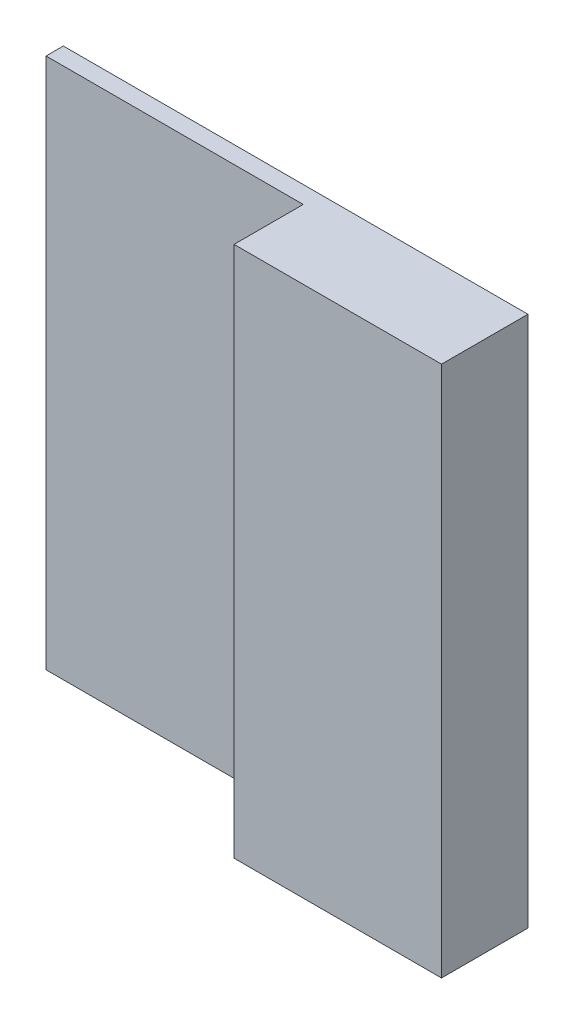
ISO-10303-21;
HEADER;
FILE_DESCRIPTION(('STEP AP214'),'2;1');
FILE_NAME('part.step','',(''),(''),'','','');
FILE_SCHEMA(('AUTOMOTIVE_DESIGN { 1 0 10303 214 1 1 1 1 }'));
ENDSEC;
DATA;
#1=APPLICATION_CONTEXT('core data for automotive mechanical design processes');
#2=APPLICATION_PROTOCOL_DEFINITION('international standard','automotive_design',2000,#1);
#3=PRODUCT_CONTEXT('',#1,'mechanical');
#4=PRODUCT('Part','Part','',(#3));
#5=PRODUCT_RELATED_PRODUCT_CATEGORY('part','',(#4));
#6=PRODUCT_DEFINITION_FORMATION('','',#4);
#7=PRODUCT_DEFINITION_CONTEXT('part definition',#1,'design');
#8=PRODUCT_DEFINITION('design','',#6,#7);
#9=PRODUCT_DEFINITION_SHAPE('','',#8);
#10=(LENGTH_UNIT() NAMED_UNIT(*) SI_UNIT(.MILLI.,.METRE.));
#11=(NAMED_UNIT(*) PLANE_ANGLE_UNIT() SI_UNIT($,.RADIAN.));
#12=(NAMED_UNIT(*) SI_UNIT($,.STERADIAN.) SOLID_ANGLE_UNIT());
#13=UNCERTAINTY_MEASURE_WITH_UNIT(LENGTH_MEASURE(1.E-05),#10,'distance_accuracy_value','');
#14=(GEOMETRIC_REPRESENTATION_CONTEXT(3) GLOBAL_UNCERTAINTY_ASSIGNED_CONTEXT((#13)) GLOBAL_UNIT_ASSIGNED_CONTEXT((#10,
#11,#12)) REPRESENTATION_CONTEXT('',''));
#15=CARTESIAN_POINT('',(0.,0.,0.));
#16=DIRECTION('',(0.,0.,1.));
#17=DIRECTION('',(1.,0.,0.));
#18=AXIS2_PLACEMENT_3D('',#15,#16,#17);
#19=CARTESIAN_POINT('',(0.,123.,-20.));
#20=DIRECTION('',(0.,0.,1.));
#21=DIRECTION('',(1.,0.,0.));
#22=AXIS2_PLACEMENT_3D('',#19,#20,#21);
#23=PLANE('',#22);
#24=DIRECTION('',(-1.,0.,0.));
#25=VECTOR('',#24,1.);
#26=CARTESIAN_POINT('',(0.,0.,-20.));
#27=LINE('',#26,#25);
#28=CARTESIAN_POINT('',(0.,0.,-20.));
#29=VERTEX_POINT('',#28);
#30=CARTESIAN_POINT('',(-107.5,0.,-20.));
#31=VERTEX_POINT('',#30);
#32=EDGE_CURVE('E119',#29,#31,#27,.T.);
#33=ORIENTED_EDGE('',*,*,#32,.T.);
#34=DIRECTION('',(0.,-1.,0.));
#35=VECTOR('',#34,1.);
#36=CARTESIAN_POINT('',(-107.5,123.,-20.));
#37=LINE('',#36,#35);
#38=CARTESIAN_POINT('',(-107.5,123.,-20.));
#39=VERTEX_POINT('',#38);
#40=EDGE_CURVE('E11',#39,#31,#37,.T.);
#41=ORIENTED_EDGE('',*,*,#40,.F.);
#42=DIRECTION('',(-1.,0.,0.));
#43=VECTOR('',#42,1.);
#44=CARTESIAN_POINT('',(0.,123.,-20.));
#45=LINE('',#44,#43);
#46=CARTESIAN_POINT('',(0.,123.,-20.));
#47=VERTEX_POINT('',#46);
#48=EDGE_CURVE('E133',#47,#39,#45,.T.);
#49=ORIENTED_EDGE('',*,*,#48,.F.);
#50=DIRECTION('',(0.,-1.,0.));
#51=VECTOR('',#50,1.);
#52=CARTESIAN_POINT('',(0.,123.,-20.));
#53=LINE('',#52,#51);
#54=EDGE_CURVE('E51',#47,#29,#53,.T.);
#55=ORIENTED_EDGE('',*,*,#54,.T.);
#56=EDGE_LOOP('',(#33,#41,#49,#55));
#57=FACE_BOUND('',#56,.T.);
#58=ADVANCED_FACE('F35',(#57),#23,.F.);
#59=CARTESIAN_POINT('',(-107.5,123.,0.));
#60=DIRECTION('',(1.,0.,0.));
#61=DIRECTION('',(0.,0.,-1.));
#62=AXIS2_PLACEMENT_3D('',#59,#60,#61);
#63=PLANE('',#62);
#64=DIRECTION('',(0.,0.,1.));
#65=VECTOR('',#64,1.);
#66=CARTESIAN_POINT('',(-107.5,0.,0.));
#67=LINE('',#66,#65);
#68=CARTESIAN_POINT('',(-107.5,0.,-16.));
#69=VERTEX_POINT('',#68);
#70=EDGE_CURVE('E121',#31,#69,#67,.T.);
#71=ORIENTED_EDGE('',*,*,#70,.T.);
#72=DIRECTION('',(0.,-1.,0.));
#73=VECTOR('',#72,1.);
#74=CARTESIAN_POINT('',(-107.5,123.,-16.));
#75=LINE('',#74,#73);
#76=CARTESIAN_POINT('',(-107.5,123.,-16.));
#77=VERTEX_POINT('',#76);
#78=EDGE_CURVE('E43',#77,#69,#75,.T.);
#79=ORIENTED_EDGE('',*,*,#78,.F.);
#80=DIRECTION('',(0.,0.,1.));
#81=VECTOR('',#80,1.);
#82=CARTESIAN_POINT('',(-107.5,123.,0.));
#83=LINE('',#82,#81);
#84=EDGE_CURVE('E83',#39,#77,#83,.T.);
#85=ORIENTED_EDGE('',*,*,#84,.F.);
#86=ORIENTED_EDGE('',*,*,#40,.T.);
#87=EDGE_LOOP('',(#71,#79,#85,#86));
#88=FACE_BOUND('',#87,.T.);
#89=ADVANCED_FACE('F139',(#88),#63,.F.);
#90=CARTESIAN_POINT('',(0.,123.,-16.));
#91=DIRECTION('',(0.,0.,1.));
#92=DIRECTION('',(1.,0.,0.));
#93=AXIS2_PLACEMENT_3D('',#90,#91,#92);
#94=PLANE('',#93);
#95=DIRECTION('',(-1.,0.,0.));
#96=VECTOR('',#95,1.);
#97=CARTESIAN_POINT('',(0.,0.,-16.));
#98=LINE('',#97,#96);
#99=CARTESIAN_POINT('',(-48.,0.,-16.));
#100=VERTEX_POINT('',#99);
#101=EDGE_CURVE('E124',#100,#69,#98,.T.);
#102=ORIENTED_EDGE('',*,*,#101,.F.);
#103=DIRECTION('',(0.,-1.,0.));
#104=VECTOR('',#103,1.);
#105=CARTESIAN_POINT('',(-48.,123.,-16.));
#106=LINE('',#105,#104);
#107=CARTESIAN_POINT('',(-48.,123.,-16.));
#108=VERTEX_POINT('',#107);
#109=EDGE_CURVE('E102',#108,#100,#106,.T.);
#110=ORIENTED_EDGE('',*,*,#109,.F.);
#111=DIRECTION('',(-1.,0.,0.));
#112=VECTOR('',#111,1.);
#113=CARTESIAN_POINT('',(0.,123.,-16.));
#114=LINE('',#113,#112);
#115=EDGE_CURVE('E111',#108,#77,#114,.T.);
#116=ORIENTED_EDGE('',*,*,#115,.T.);
#117=ORIENTED_EDGE('',*,*,#78,.T.);
#118=EDGE_LOOP('',(#102,#110,#116,#117));
#119=FACE_BOUND('',#118,.T.);
#120=ADVANCED_FACE('F138',(#119),#94,.T.);
#121=CARTESIAN_POINT('',(-48.,123.,0.));
#122=DIRECTION('',(-1.,0.,0.));
#123=DIRECTION('',(0.,0.,1.));
#124=AXIS2_PLACEMENT_3D('',#121,#122,#123);
#125=PLANE('',#124);
#126=DIRECTION('',(0.,0.,-1.));
#127=VECTOR('',#126,1.);
#128=CARTESIAN_POINT('',(-48.,0.,0.));
#129=LINE('',#128,#127);
#130=CARTESIAN_POINT('',(-48.,0.,0.));
#131=VERTEX_POINT('',#130);
#132=EDGE_CURVE('E98',#131,#100,#129,.T.);
#133=ORIENTED_EDGE('',*,*,#132,.F.);
#134=DIRECTION('',(0.,-1.,0.));
#135=VECTOR('',#134,1.);
#136=CARTESIAN_POINT('',(-48.,123.,0.));
#137=LINE('',#136,#135);
#138=CARTESIAN_POINT('',(-48.,123.,0.));
#139=VERTEX_POINT('',#138);
#140=EDGE_CURVE('E93',#139,#131,#137,.T.);
#141=ORIENTED_EDGE('',*,*,#140,.F.);
#142=DIRECTION('',(0.,0.,-1.));
#143=VECTOR('',#142,1.);
#144=CARTESIAN_POINT('',(-48.,123.,0.));
#145=LINE('',#144,#143);
#146=EDGE_CURVE('E96',#139,#108,#145,.T.);
#147=ORIENTED_EDGE('',*,*,#146,.T.);
#148=ORIENTED_EDGE('',*,*,#109,.T.);
#149=EDGE_LOOP('',(#133,#141,#147,#148));
#150=FACE_BOUND('',#149,.T.);
#151=ADVANCED_FACE('F95',(#150),#125,.T.);
#152=CARTESIAN_POINT('',(0.,123.,0.));
#153=DIRECTION('',(0.,0.,1.));
#154=DIRECTION('',(1.,0.,0.));
#155=AXIS2_PLACEMENT_3D('',#152,#153,#154);
#156=PLANE('',#155);
#157=DIRECTION('',(-1.,0.,0.));
#158=VECTOR('',#157,1.);
#159=CARTESIAN_POINT('',(0.,0.,0.));
#160=LINE('',#159,#158);
#161=CARTESIAN_POINT('',(0.,0.,0.));
#162=VERTEX_POINT('',#161);
#163=EDGE_CURVE('E128',#162,#131,#160,.T.);
#164=ORIENTED_EDGE('',*,*,#163,.F.);
#165=DIRECTION('',(0.,-1.,0.));
#166=VECTOR('',#165,1.);
#167=CARTESIAN_POINT('',(0.,123.,0.));
#168=LINE('',#167,#166);
#169=CARTESIAN_POINT('',(0.,123.,0.));
#170=VERTEX_POINT('',#169);
#171=EDGE_CURVE('E71',#170,#162,#168,.T.);
#172=ORIENTED_EDGE('',*,*,#171,.F.);
#173=DIRECTION('',(-1.,0.,0.));
#174=VECTOR('',#173,1.);
#175=CARTESIAN_POINT('',(0.,123.,0.));
#176=LINE('',#175,#174);
#177=EDGE_CURVE('E109',#170,#139,#176,.T.);
#178=ORIENTED_EDGE('',*,*,#177,.T.);
#179=ORIENTED_EDGE('',*,*,#140,.T.);
#180=EDGE_LOOP('',(#164,#172,#178,#179));
#181=FACE_BOUND('',#180,.T.);
#182=ADVANCED_FACE('F113',(#181),#156,.T.);
#183=CARTESIAN_POINT('',(0.,123.,0.));
#184=DIRECTION('',(1.,0.,0.));
#185=DIRECTION('',(0.,0.,-1.));
#186=AXIS2_PLACEMENT_3D('',#183,#184,#185);
#187=PLANE('',#186);
#188=DIRECTION('',(0.,0.,1.));
#189=VECTOR('',#188,1.);
#190=CARTESIAN_POINT('',(0.,0.,0.));
#191=LINE('',#190,#189);
#192=EDGE_CURVE('E130',#29,#162,#191,.T.);
#193=ORIENTED_EDGE('',*,*,#192,.F.);
#194=ORIENTED_EDGE('',*,*,#54,.F.);
#195=DIRECTION('',(0.,0.,1.));
#196=VECTOR('',#195,1.);
#197=CARTESIAN_POINT('',(0.,123.,0.));
#198=LINE('',#197,#196);
#199=EDGE_CURVE('E114',#47,#170,#198,.T.);
#200=ORIENTED_EDGE('',*,*,#199,.T.);
#201=ORIENTED_EDGE('',*,*,#171,.T.);
#202=EDGE_LOOP('',(#193,#194,#200,#201));
#203=FACE_BOUND('',#202,.T.);
#204=ADVANCED_FACE('F143',(#203),#187,.T.);
#205=CARTESIAN_POINT('',(0.,123.,0.));
#206=DIRECTION('',(0.,1.,0.));
#207=DIRECTION('',(0.,0.,1.));
#208=AXIS2_PLACEMENT_3D('',#205,#206,#207);
#209=PLANE('',#208);
#210=ORIENTED_EDGE('',*,*,#48,.T.);
#211=ORIENTED_EDGE('',*,*,#84,.T.);
#212=ORIENTED_EDGE('',*,*,#115,.F.);
#213=ORIENTED_EDGE('',*,*,#146,.F.);
#214=ORIENTED_EDGE('',*,*,#177,.F.);
#215=ORIENTED_EDGE('',*,*,#199,.F.);
#216=EDGE_LOOP('',(#210,#211,#212,#213,#214,#215));
#217=FACE_BOUND('',#216,.T.);
#218=ADVANCED_FACE('F107',(#217),#209,.T.);
#219=CARTESIAN_POINT('',(0.,0.,0.));
#220=DIRECTION('',(0.,1.,0.));
#221=DIRECTION('',(0.,0.,1.));
#222=AXIS2_PLACEMENT_3D('',#219,#220,#221);
#223=PLANE('',#222);
#224=ORIENTED_EDGE('',*,*,#32,.F.);
#225=ORIENTED_EDGE('',*,*,#192,.T.);
#226=ORIENTED_EDGE('',*,*,#163,.T.);
#227=ORIENTED_EDGE('',*,*,#132,.T.);
#228=ORIENTED_EDGE('',*,*,#101,.T.);
#229=ORIENTED_EDGE('',*,*,#70,.F.);
#230=EDGE_LOOP('',(#224,#225,#226,#227,#228,#229));
#231=FACE_BOUND('',#230,.T.);
#232=ADVANCED_FACE('F142',(#231),#223,.F.);
#233=CLOSED_SHELL('',(#58,#89,#120,#151,#182,#204,#218,#232));
#234=MANIFOLD_SOLID_BREP('B2',#233);
#235=ADVANCED_BREP_SHAPE_REPRESENTATION('',(#18,#234),#14);
#236=SHAPE_DEFINITION_REPRESENTATION(#9,#235);
ENDSEC;
END-ISO-10303-21;
